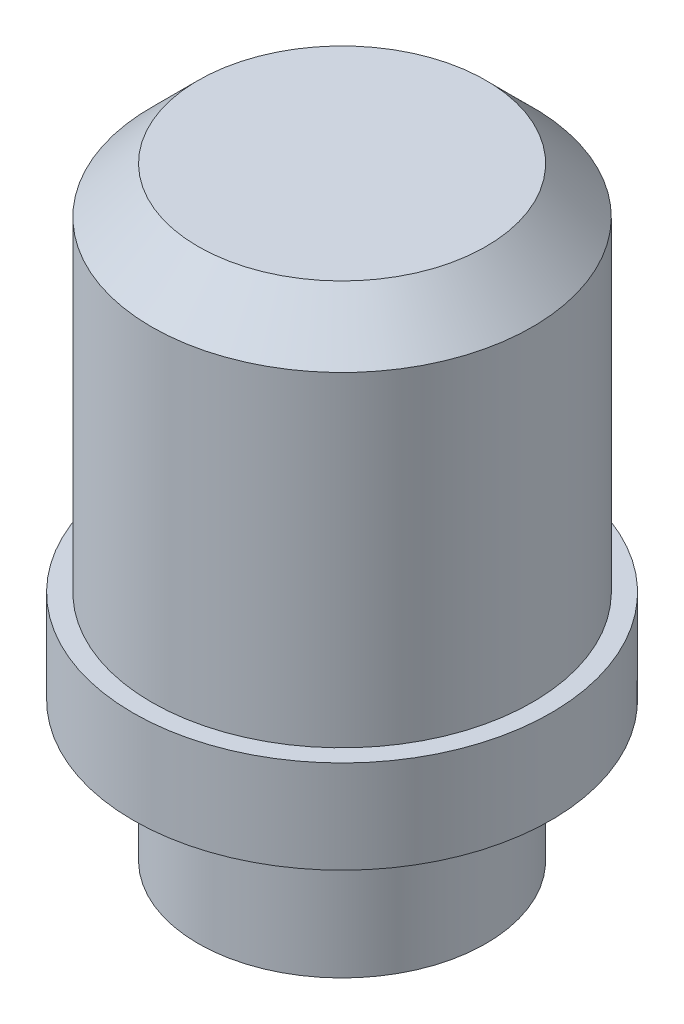
ISO-10303-21;
HEADER;
FILE_DESCRIPTION(('STEP AP214'),'2;1');
FILE_NAME('part.step','',(''),(''),'','','');
FILE_SCHEMA(('AUTOMOTIVE_DESIGN { 1 0 10303 214 1 1 1 1 }'));
ENDSEC;
DATA;
#1=APPLICATION_CONTEXT('core data for automotive mechanical design processes');
#2=APPLICATION_PROTOCOL_DEFINITION('international standard','automotive_design',2000,#1);
#3=PRODUCT_CONTEXT('',#1,'mechanical');
#4=PRODUCT('Part','Part','',(#3));
#5=PRODUCT_RELATED_PRODUCT_CATEGORY('part','',(#4));
#6=PRODUCT_DEFINITION_FORMATION('','',#4);
#7=PRODUCT_DEFINITION_CONTEXT('part definition',#1,'design');
#8=PRODUCT_DEFINITION('design','',#6,#7);
#9=PRODUCT_DEFINITION_SHAPE('','',#8);
#10=(LENGTH_UNIT() NAMED_UNIT(*) SI_UNIT(.MILLI.,.METRE.));
#11=(NAMED_UNIT(*) PLANE_ANGLE_UNIT() SI_UNIT($,.RADIAN.));
#12=(NAMED_UNIT(*) SI_UNIT($,.STERADIAN.) SOLID_ANGLE_UNIT());
#13=UNCERTAINTY_MEASURE_WITH_UNIT(LENGTH_MEASURE(1.E-05),#10,'distance_accuracy_value','');
#14=(GEOMETRIC_REPRESENTATION_CONTEXT(3) GLOBAL_UNCERTAINTY_ASSIGNED_CONTEXT((#13)) GLOBAL_UNIT_ASSIGNED_CONTEXT((#10,
#11,#12)) REPRESENTATION_CONTEXT('',''));
#15=CARTESIAN_POINT('',(0.,0.,0.));
#16=DIRECTION('',(0.,0.,1.));
#17=DIRECTION('',(1.,0.,0.));
#18=AXIS2_PLACEMENT_3D('',#15,#16,#17);
#19=CARTESIAN_POINT('',(0.,5.,0.));
#20=DIRECTION('',(0.,-1.,0.));
#21=DIRECTION('',(0.,0.,-1.));
#22=AXIS2_PLACEMENT_3D('',#19,#20,#21);
#23=CYLINDRICAL_SURFACE('',#22,3.1);
#24=CARTESIAN_POINT('',(0.,0.,0.));
#25=DIRECTION('',(0.,1.,0.));
#26=DIRECTION('',(0.,0.,1.));
#27=AXIS2_PLACEMENT_3D('',#24,#25,#26);
#28=CIRCLE('',#27,3.1);
#29=CARTESIAN_POINT('',(0.,0.,3.1));
#30=VERTEX_POINT('',#29);
#31=EDGE_CURVE('E57',#30,#30,#28,.T.);
#32=ORIENTED_EDGE('',*,*,#31,.T.);
#33=EDGE_LOOP('',(#32));
#34=FACE_BOUND('',#33,.T.);
#35=CARTESIAN_POINT('',(0.,3.,0.));
#36=DIRECTION('',(0.,1.,0.));
#37=DIRECTION('',(0.,0.,1.));
#38=AXIS2_PLACEMENT_3D('',#35,#36,#37);
#39=CIRCLE('',#38,3.1);
#40=CARTESIAN_POINT('',(0.,3.,3.1));
#41=VERTEX_POINT('',#40);
#42=EDGE_CURVE('E52',#41,#41,#39,.T.);
#43=ORIENTED_EDGE('',*,*,#42,.F.);
#44=EDGE_LOOP('',(#43));
#45=FACE_BOUND('',#44,.T.);
#46=ADVANCED_FACE('F36',(#34,#45),#23,.T.);
#47=CARTESIAN_POINT('',(0.,0.,0.));
#48=DIRECTION('',(0.,1.,0.));
#49=DIRECTION('',(0.,0.,1.));
#50=AXIS2_PLACEMENT_3D('',#47,#48,#49);
#51=PLANE('',#50);
#52=ORIENTED_EDGE('',*,*,#31,.F.);
#53=EDGE_LOOP('',(#52));
#54=FACE_BOUND('',#53,.T.);
#55=ADVANCED_FACE('F73',(#54),#51,.F.);
#56=CARTESIAN_POINT('',(0.,5.,0.));
#57=DIRECTION('',(0.,-1.,0.));
#58=DIRECTION('',(0.,0.,-1.));
#59=AXIS2_PLACEMENT_3D('',#56,#57,#58);
#60=CYLINDRICAL_SURFACE('',#59,4.5);
#61=CARTESIAN_POINT('',(0.,5.,0.));
#62=DIRECTION('',(0.,1.,0.));
#63=DIRECTION('',(0.,0.,1.));
#64=AXIS2_PLACEMENT_3D('',#61,#62,#63);
#65=CIRCLE('',#64,4.5);
#66=CARTESIAN_POINT('',(0.,5.,4.5));
#67=VERTEX_POINT('',#66);
#68=EDGE_CURVE('E60',#67,#67,#65,.T.);
#69=ORIENTED_EDGE('',*,*,#68,.F.);
#70=EDGE_LOOP('',(#69));
#71=FACE_BOUND('',#70,.T.);
#72=CARTESIAN_POINT('',(0.,3.,0.));
#73=DIRECTION('',(0.,1.,0.));
#74=DIRECTION('',(0.,0.,1.));
#75=AXIS2_PLACEMENT_3D('',#72,#73,#74);
#76=CIRCLE('',#75,4.5);
#77=CARTESIAN_POINT('',(0.,3.,4.5));
#78=VERTEX_POINT('',#77);
#79=EDGE_CURVE('E61',#78,#78,#76,.T.);
#80=ORIENTED_EDGE('',*,*,#79,.T.);
#81=EDGE_LOOP('',(#80));
#82=FACE_BOUND('',#81,.T.);
#83=ADVANCED_FACE('F69',(#71,#82),#60,.T.);
#84=CARTESIAN_POINT('',(0.,3.,0.));
#85=DIRECTION('',(0.,1.,0.));
#86=DIRECTION('',(0.,0.,1.));
#87=AXIS2_PLACEMENT_3D('',#84,#85,#86);
#88=PLANE('',#87);
#89=ORIENTED_EDGE('',*,*,#42,.T.);
#90=EDGE_LOOP('',(#89));
#91=FACE_BOUND('',#90,.T.);
#92=ORIENTED_EDGE('',*,*,#79,.F.);
#93=EDGE_LOOP('',(#92));
#94=FACE_BOUND('',#93,.T.);
#95=ADVANCED_FACE('F72',(#91,#94),#88,.F.);
#96=CARTESIAN_POINT('',(0.,5.,0.));
#97=DIRECTION('',(0.,1.,0.));
#98=DIRECTION('',(0.,0.,1.));
#99=AXIS2_PLACEMENT_3D('',#96,#97,#98);
#100=PLANE('',#99);
#101=CARTESIAN_POINT('',(0.,5.,0.));
#102=DIRECTION('',(0.,1.,0.));
#103=DIRECTION('',(0.,0.,1.));
#104=AXIS2_PLACEMENT_3D('',#101,#102,#103);
#105=CIRCLE('',#104,4.1);
#106=CARTESIAN_POINT('',(0.,5.,4.1));
#107=VERTEX_POINT('',#106);
#108=EDGE_CURVE('E48',#107,#107,#105,.T.);
#109=ORIENTED_EDGE('',*,*,#108,.F.);
#110=EDGE_LOOP('',(#109));
#111=FACE_BOUND('',#110,.T.);
#112=ORIENTED_EDGE('',*,*,#68,.T.);
#113=EDGE_LOOP('',(#112));
#114=FACE_BOUND('',#113,.T.);
#115=ADVANCED_FACE('F67',(#111,#114),#100,.T.);
#116=CARTESIAN_POINT('',(0.,13.,0.));
#117=DIRECTION('',(0.,-1.,0.));
#118=DIRECTION('',(0.,0.,-1.));
#119=AXIS2_PLACEMENT_3D('',#116,#117,#118);
#120=CYLINDRICAL_SURFACE('',#119,4.1);
#121=CARTESIAN_POINT('',(0.,12.,0.));
#122=DIRECTION('',(0.,1.,0.));
#123=DIRECTION('',(0.,0.,1.));
#124=AXIS2_PLACEMENT_3D('',#121,#122,#123);
#125=CIRCLE('',#124,4.1);
#126=CARTESIAN_POINT('',(0.,12.,4.1));
#127=VERTEX_POINT('',#126);
#128=EDGE_CURVE('E10',#127,#127,#125,.F.);
#129=ORIENTED_EDGE('',*,*,#128,.T.);
#130=EDGE_LOOP('',(#129));
#131=FACE_BOUND('',#130,.T.);
#132=ORIENTED_EDGE('',*,*,#108,.T.);
#133=EDGE_LOOP('',(#132));
#134=FACE_BOUND('',#133,.T.);
#135=ADVANCED_FACE('F83',(#131,#134),#120,.T.);
#136=CARTESIAN_POINT('',(0.,13.,0.));
#137=DIRECTION('',(0.,1.,0.));
#138=DIRECTION('',(0.,0.,1.));
#139=AXIS2_PLACEMENT_3D('',#136,#137,#138);
#140=PLANE('',#139);
#141=CARTESIAN_POINT('',(0.,13.,0.));
#142=DIRECTION('',(0.,1.,0.));
#143=DIRECTION('',(0.,0.,1.));
#144=AXIS2_PLACEMENT_3D('',#141,#142,#143);
#145=CIRCLE('',#144,3.1);
#146=CARTESIAN_POINT('',(0.,13.,3.1));
#147=VERTEX_POINT('',#146);
#148=EDGE_CURVE('E44',#147,#147,#145,.T.);
#149=ORIENTED_EDGE('',*,*,#148,.T.);
#150=EDGE_LOOP('',(#149));
#151=FACE_BOUND('',#150,.T.);
#152=ADVANCED_FACE('F125',(#151),#140,.T.);
#153=CARTESIAN_POINT('',(0.,13.,0.));
#154=DIRECTION('',(0.,-1.,0.));
#155=DIRECTION('',(0.,0.,-1.));
#156=AXIS2_PLACEMENT_3D('',#153,#154,#155);
#157=CONICAL_SURFACE('',#156,3.1,0.785398163397447);
#158=ORIENTED_EDGE('',*,*,#128,.F.);
#159=EDGE_LOOP('',(#158));
#160=FACE_BOUND('',#159,.T.);
#161=ORIENTED_EDGE('',*,*,#148,.F.);
#162=EDGE_LOOP('',(#161));
#163=FACE_BOUND('',#162,.T.);
#164=ADVANCED_FACE('F39',(#160,#163),#157,.T.);
#165=CLOSED_SHELL('',(#46,#55,#83,#95,#115,#135,#152,#164));
#166=MANIFOLD_SOLID_BREP('B2',#165);
#167=ADVANCED_BREP_SHAPE_REPRESENTATION('',(#18,#166),#14);
#168=SHAPE_DEFINITION_REPRESENTATION(#9,#167);
ENDSEC;
END-ISO-10303-21;
